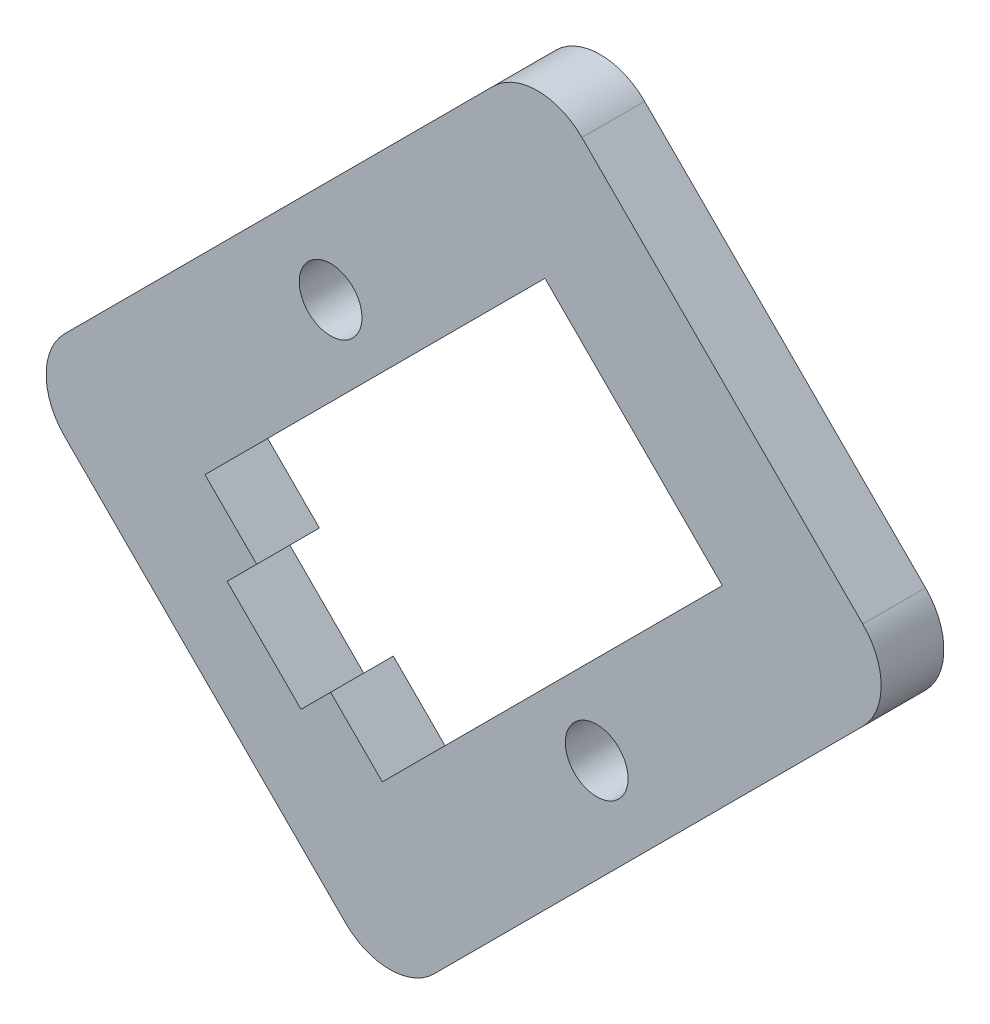
ISO-10303-21;
HEADER;
FILE_DESCRIPTION(('STEP AP214'),'2;1');
FILE_NAME('part.step','',(''),(''),'','','');
FILE_SCHEMA(('AUTOMOTIVE_DESIGN { 1 0 10303 214 1 1 1 1 }'));
ENDSEC;
DATA;
#1=APPLICATION_CONTEXT('core data for automotive mechanical design processes');
#2=APPLICATION_PROTOCOL_DEFINITION('international standard','automotive_design',2000,#1);
#3=PRODUCT_CONTEXT('',#1,'mechanical');
#4=PRODUCT('Part','Part','',(#3));
#5=PRODUCT_RELATED_PRODUCT_CATEGORY('part','',(#4));
#6=PRODUCT_DEFINITION_FORMATION('','',#4);
#7=PRODUCT_DEFINITION_CONTEXT('part definition',#1,'design');
#8=PRODUCT_DEFINITION('design','',#6,#7);
#9=PRODUCT_DEFINITION_SHAPE('','',#8);
#10=(LENGTH_UNIT() NAMED_UNIT(*) SI_UNIT(.MILLI.,.METRE.));
#11=(NAMED_UNIT(*) PLANE_ANGLE_UNIT() SI_UNIT($,.RADIAN.));
#12=(NAMED_UNIT(*) SI_UNIT($,.STERADIAN.) SOLID_ANGLE_UNIT());
#13=UNCERTAINTY_MEASURE_WITH_UNIT(LENGTH_MEASURE(1.E-05),#10,'distance_accuracy_value','');
#14=(GEOMETRIC_REPRESENTATION_CONTEXT(3) GLOBAL_UNCERTAINTY_ASSIGNED_CONTEXT((#13)) GLOBAL_UNIT_ASSIGNED_CONTEXT((#10,
#11,#12)) REPRESENTATION_CONTEXT('',''));
#15=CARTESIAN_POINT('',(0.,0.,0.));
#16=DIRECTION('',(0.,0.,1.));
#17=DIRECTION('',(1.,0.,0.));
#18=AXIS2_PLACEMENT_3D('',#15,#16,#17);
#19=CARTESIAN_POINT('',(77.9726304703363,27.0293999836904,3.));
#20=DIRECTION('',(0.,0.,1.));
#21=DIRECTION('',(1.,0.,0.));
#22=AXIS2_PLACEMENT_3D('',#19,#20,#21);
#23=PLANE('',#22);
#24=CARTESIAN_POINT('',(75.1442033479472,50.3639237628465,3.));
#25=DIRECTION('',(0.,0.,1.));
#26=DIRECTION('',(1.,0.,0.));
#27=AXIS2_PLACEMENT_3D('',#24,#25,#26);
#28=CIRCLE('',#27,1.50000000166663);
#29=CARTESIAN_POINT('',(76.6442033496138,50.3639237628465,3.));
#30=VERTEX_POINT('',#29);
#31=EDGE_CURVE('E184',#30,#30,#28,.T.);
#32=ORIENTED_EDGE('',*,*,#31,.F.);
#33=EDGE_LOOP('',(#32));
#34=FACE_BOUND('',#33,.T.);
#35=CARTESIAN_POINT('',(77.9726304703363,27.0293999836904,3.));
#36=DIRECTION('',(0.,0.,1.));
#37=DIRECTION('',(1.,0.,0.));
#38=AXIS2_PLACEMENT_3D('',#35,#36,#37);
#39=CIRCLE('',#38,3.00000000000005);
#40=CARTESIAN_POINT('',(75.8513101267766,24.9080796401308,3.));
#41=VERTEX_POINT('',#40);
#42=CARTESIAN_POINT('',(80.093950813896,24.9080796401308,3.));
#43=VERTEX_POINT('',#42);
#44=EDGE_CURVE('E214',#41,#43,#39,.T.);
#45=ORIENTED_EDGE('',*,*,#44,.T.);
#46=DIRECTION('',(0.70710678118655,0.707106781186545,0.));
#47=VECTOR('',#46,1.);
#48=CARTESIAN_POINT('',(80.093950813896,24.9080796401308,3.));
#49=LINE('',#48,#47);
#50=CARTESIAN_POINT('',(100.600047468306,45.4141762945406,3.));
#51=VERTEX_POINT('',#50);
#52=EDGE_CURVE('E217',#43,#51,#49,.T.);
#53=ORIENTED_EDGE('',*,*,#52,.T.);
#54=CARTESIAN_POINT('',(98.4787271247462,47.5354966381002,3.));
#55=DIRECTION('',(0.,0.,1.));
#56=DIRECTION('',(1.,0.,0.));
#57=AXIS2_PLACEMENT_3D('',#54,#55,#56);
#58=CIRCLE('',#57,3.00000000000005);
#59=CARTESIAN_POINT('',(100.600047468306,49.65681698166,3.));
#60=VERTEX_POINT('',#59);
#61=EDGE_CURVE('E220',#51,#60,#58,.T.);
#62=ORIENTED_EDGE('',*,*,#61,.T.);
#63=DIRECTION('',(-0.707106781186544,0.707106781186551,0.));
#64=VECTOR('',#63,1.);
#65=CARTESIAN_POINT('',(87.1650186257615,63.0918458242043,3.));
#66=LINE('',#65,#64);
#67=CARTESIAN_POINT('',(87.1650186257615,63.0918458242043,3.));
#68=VERTEX_POINT('',#67);
#69=EDGE_CURVE('E222',#60,#68,#66,.T.);
#70=ORIENTED_EDGE('',*,*,#69,.T.);
#71=CARTESIAN_POINT('',(85.0436982822019,60.9705254806447,3.));
#72=DIRECTION('',(0.,0.,1.));
#73=DIRECTION('',(1.,0.,0.));
#74=AXIS2_PLACEMENT_3D('',#71,#72,#73);
#75=CIRCLE('',#74,3.00000000000002);
#76=CARTESIAN_POINT('',(82.9223779386422,63.0918458242043,3.));
#77=VERTEX_POINT('',#76);
#78=EDGE_CURVE('E224',#68,#77,#75,.T.);
#79=ORIENTED_EDGE('',*,*,#78,.T.);
#80=DIRECTION('',(-0.707106781186546,-0.707106781186549,0.));
#81=VECTOR('',#80,1.);
#82=CARTESIAN_POINT('',(82.9223779386422,63.0918458242043,3.));
#83=LINE('',#82,#81);
#84=CARTESIAN_POINT('',(62.4162812842323,42.5857491697944,3.));
#85=VERTEX_POINT('',#84);
#86=EDGE_CURVE('E226',#77,#85,#83,.T.);
#87=ORIENTED_EDGE('',*,*,#86,.T.);
#88=CARTESIAN_POINT('',(64.537601627792,40.4644288262348,3.));
#89=DIRECTION('',(0.,0.,1.));
#90=DIRECTION('',(1.,0.,0.));
#91=AXIS2_PLACEMENT_3D('',#88,#89,#90);
#92=CIRCLE('',#91,2.99999999999997);
#93=CARTESIAN_POINT('',(62.4162812842324,38.3431084826752,3.));
#94=VERTEX_POINT('',#93);
#95=EDGE_CURVE('E228',#85,#94,#92,.T.);
#96=ORIENTED_EDGE('',*,*,#95,.T.);
#97=DIRECTION('',(0.707106781186543,-0.707106781186552,0.));
#98=VECTOR('',#97,1.);
#99=CARTESIAN_POINT('',(62.4162812842324,38.3431084826752,3.));
#100=LINE('',#99,#98);
#101=EDGE_CURVE('E230',#94,#41,#100,.T.);
#102=ORIENTED_EDGE('',*,*,#101,.T.);
#103=EDGE_LOOP('',(#45,#53,#62,#70,#79,#87,#96,#102));
#104=FACE_BOUND('',#103,.T.);
#105=DIRECTION('',(0.707106781186547,-0.707106781186549,0.));
#106=VECTOR('',#105,1.);
#107=CARTESIAN_POINT('',(75.1442033455902,34.1004677955558,3.));
#108=LINE('',#107,#106);
#109=CARTESIAN_POINT('',(75.1442033455902,34.1004677955558,3.));
#110=VERTEX_POINT('',#109);
#111=CARTESIAN_POINT('',(77.6190770797431,31.625594061403,3.));
#112=VERTEX_POINT('',#111);
#113=EDGE_CURVE('E154',#110,#112,#108,.T.);
#114=ORIENTED_EDGE('',*,*,#113,.F.);
#115=DIRECTION('',(0.707106781186553,0.707106781186542,0.));
#116=VECTOR('',#115,1.);
#117=CARTESIAN_POINT('',(73.729919072539,32.6861835225046,3.));
#118=LINE('',#117,#116);
#119=CARTESIAN_POINT('',(73.729919072539,32.6861835225046,3.));
#120=VERTEX_POINT('',#119);
#121=EDGE_CURVE('E146',#120,#110,#118,.T.);
#122=ORIENTED_EDGE('',*,*,#121,.F.);
#123=DIRECTION('',(0.707106781186557,-0.707106781186538,0.));
#124=VECTOR('',#123,1.);
#125=CARTESIAN_POINT('',(70.1943851666062,36.2217174284374,3.));
#126=LINE('',#125,#124);
#127=CARTESIAN_POINT('',(70.1943851666062,36.2217174284374,3.));
#128=VERTEX_POINT('',#127);
#129=EDGE_CURVE('E181',#128,#120,#126,.T.);
#130=ORIENTED_EDGE('',*,*,#129,.F.);
#131=DIRECTION('',(-0.70710678118657,-0.707106781186525,0.));
#132=VECTOR('',#131,1.);
#133=CARTESIAN_POINT('',(71.6086694396575,37.6360017014886,3.));
#134=LINE('',#133,#132);
#135=CARTESIAN_POINT('',(71.6086694396575,37.6360017014886,3.));
#136=VERTEX_POINT('',#135);
#137=EDGE_CURVE('E179',#136,#128,#134,.T.);
#138=ORIENTED_EDGE('',*,*,#137,.F.);
#139=DIRECTION('',(0.707106781186555,-0.70710678118654,0.));
#140=VECTOR('',#139,1.);
#141=CARTESIAN_POINT('',(69.1337957055045,40.1108754356415,3.));
#142=LINE('',#141,#140);
#143=CARTESIAN_POINT('',(69.1337957055045,40.1108754356415,3.));
#144=VERTEX_POINT('',#143);
#145=EDGE_CURVE('E177',#144,#136,#142,.T.);
#146=ORIENTED_EDGE('',*,*,#145,.F.);
#147=DIRECTION('',(-0.707106781186547,-0.707106781186548,0.));
#148=VECTOR('',#147,1.);
#149=CARTESIAN_POINT('',(85.3972516727952,56.3743314029322,3.));
#150=LINE('',#149,#148);
#151=CARTESIAN_POINT('',(85.3972516727952,56.3743314029322,3.));
#152=VERTEX_POINT('',#151);
#153=EDGE_CURVE('E175',#152,#144,#150,.T.);
#154=ORIENTED_EDGE('',*,*,#153,.F.);
#155=DIRECTION('',(-0.707106781186539,0.707106781186556,0.));
#156=VECTOR('',#155,1.);
#157=CARTESIAN_POINT('',(93.8825330470337,47.8890500286935,3.));
#158=LINE('',#157,#156);
#159=CARTESIAN_POINT('',(93.8825330470337,47.8890500286935,3.));
#160=VERTEX_POINT('',#159);
#161=EDGE_CURVE('E170',#160,#152,#158,.T.);
#162=ORIENTED_EDGE('',*,*,#161,.F.);
#163=DIRECTION('',(0.707106781186549,0.707106781186546,0.));
#164=VECTOR('',#163,1.);
#165=CARTESIAN_POINT('',(77.6190770797431,31.625594061403,3.));
#166=LINE('',#165,#164);
#167=EDGE_CURVE('E168',#112,#160,#166,.T.);
#168=ORIENTED_EDGE('',*,*,#167,.F.);
#169=EDGE_LOOP('',(#114,#122,#130,#138,#146,#154,#162,#168));
#170=FACE_BOUND('',#169,.T.);
#171=CARTESIAN_POINT('',(87.872125409305,37.6360017014886,3.));
#172=DIRECTION('',(0.,0.,1.));
#173=DIRECTION('',(1.,0.,0.));
#174=AXIS2_PLACEMENT_3D('',#171,#172,#173);
#175=CIRCLE('',#174,1.5000000016666);
#176=CARTESIAN_POINT('',(89.3721254109716,37.6360017014886,3.));
#177=VERTEX_POINT('',#176);
#178=EDGE_CURVE('E370',#177,#177,#175,.T.);
#179=ORIENTED_EDGE('',*,*,#178,.F.);
#180=EDGE_LOOP('',(#179));
#181=FACE_BOUND('',#180,.T.);
#182=ADVANCED_FACE('F33',(#34,#104,#170,#181),#23,.T.);
#183=CARTESIAN_POINT('',(77.9726304703363,27.0293999836904,0.));
#184=DIRECTION('',(0.,0.,1.));
#185=DIRECTION('',(1.,0.,0.));
#186=AXIS2_PLACEMENT_3D('',#183,#184,#185);
#187=PLANE('',#186);
#188=CARTESIAN_POINT('',(77.9726304703363,27.0293999836904,0.));
#189=DIRECTION('',(0.,0.,1.));
#190=DIRECTION('',(1.,0.,0.));
#191=AXIS2_PLACEMENT_3D('',#188,#189,#190);
#192=CIRCLE('',#191,3.00000000000005);
#193=CARTESIAN_POINT('',(75.8513101267766,24.9080796401308,0.));
#194=VERTEX_POINT('',#193);
#195=CARTESIAN_POINT('',(80.093950813896,24.9080796401308,0.));
#196=VERTEX_POINT('',#195);
#197=EDGE_CURVE('E162',#194,#196,#192,.T.);
#198=ORIENTED_EDGE('',*,*,#197,.F.);
#199=DIRECTION('',(0.707106781186543,-0.707106781186552,0.));
#200=VECTOR('',#199,1.);
#201=CARTESIAN_POINT('',(62.4162812842324,38.3431084826752,0.));
#202=LINE('',#201,#200);
#203=CARTESIAN_POINT('',(62.4162812842324,38.3431084826752,0.));
#204=VERTEX_POINT('',#203);
#205=EDGE_CURVE('E218',#204,#194,#202,.T.);
#206=ORIENTED_EDGE('',*,*,#205,.F.);
#207=CARTESIAN_POINT('',(64.537601627792,40.4644288262348,0.));
#208=DIRECTION('',(0.,0.,1.));
#209=DIRECTION('',(1.,0.,0.));
#210=AXIS2_PLACEMENT_3D('',#207,#208,#209);
#211=CIRCLE('',#210,2.99999999999997);
#212=CARTESIAN_POINT('',(62.4162812842323,42.5857491697944,0.));
#213=VERTEX_POINT('',#212);
#214=EDGE_CURVE('E245',#213,#204,#211,.T.);
#215=ORIENTED_EDGE('',*,*,#214,.F.);
#216=DIRECTION('',(-0.707106781186546,-0.707106781186549,0.));
#217=VECTOR('',#216,1.);
#218=CARTESIAN_POINT('',(82.9223779386422,63.0918458242043,0.));
#219=LINE('',#218,#217);
#220=CARTESIAN_POINT('',(82.9223779386422,63.0918458242043,0.));
#221=VERTEX_POINT('',#220);
#222=EDGE_CURVE('E243',#221,#213,#219,.T.);
#223=ORIENTED_EDGE('',*,*,#222,.F.);
#224=CARTESIAN_POINT('',(85.0436982822019,60.9705254806447,0.));
#225=DIRECTION('',(0.,0.,1.));
#226=DIRECTION('',(1.,0.,0.));
#227=AXIS2_PLACEMENT_3D('',#224,#225,#226);
#228=CIRCLE('',#227,3.00000000000002);
#229=CARTESIAN_POINT('',(87.1650186257615,63.0918458242043,0.));
#230=VERTEX_POINT('',#229);
#231=EDGE_CURVE('E241',#230,#221,#228,.T.);
#232=ORIENTED_EDGE('',*,*,#231,.F.);
#233=DIRECTION('',(-0.707106781186544,0.707106781186551,0.));
#234=VECTOR('',#233,1.);
#235=CARTESIAN_POINT('',(87.1650186257615,63.0918458242043,0.));
#236=LINE('',#235,#234);
#237=CARTESIAN_POINT('',(100.600047468306,49.65681698166,0.));
#238=VERTEX_POINT('',#237);
#239=EDGE_CURVE('E239',#238,#230,#236,.T.);
#240=ORIENTED_EDGE('',*,*,#239,.F.);
#241=CARTESIAN_POINT('',(98.4787271247462,47.5354966381002,0.));
#242=DIRECTION('',(0.,0.,1.));
#243=DIRECTION('',(1.,0.,0.));
#244=AXIS2_PLACEMENT_3D('',#241,#242,#243);
#245=CIRCLE('',#244,3.00000000000005);
#246=CARTESIAN_POINT('',(100.600047468306,45.4141762945406,0.));
#247=VERTEX_POINT('',#246);
#248=EDGE_CURVE('E237',#247,#238,#245,.T.);
#249=ORIENTED_EDGE('',*,*,#248,.F.);
#250=DIRECTION('',(0.70710678118655,0.707106781186545,0.));
#251=VECTOR('',#250,1.);
#252=CARTESIAN_POINT('',(80.093950813896,24.9080796401308,0.));
#253=LINE('',#252,#251);
#254=EDGE_CURVE('E235',#196,#247,#253,.T.);
#255=ORIENTED_EDGE('',*,*,#254,.F.);
#256=EDGE_LOOP('',(#198,#206,#215,#223,#232,#240,#249,#255));
#257=FACE_BOUND('',#256,.T.);
#258=DIRECTION('',(0.707106781186553,0.707106781186542,0.));
#259=VECTOR('',#258,1.);
#260=CARTESIAN_POINT('',(73.729919072539,32.6861835225046,0.));
#261=LINE('',#260,#259);
#262=CARTESIAN_POINT('',(73.729919072539,32.6861835225046,0.));
#263=VERTEX_POINT('',#262);
#264=CARTESIAN_POINT('',(75.1442033455902,34.1004677955558,0.));
#265=VERTEX_POINT('',#264);
#266=EDGE_CURVE('E56',#263,#265,#261,.T.);
#267=ORIENTED_EDGE('',*,*,#266,.T.);
#268=DIRECTION('',(0.707106781186547,-0.707106781186549,0.));
#269=VECTOR('',#268,1.);
#270=CARTESIAN_POINT('',(75.1442033455902,34.1004677955558,0.));
#271=LINE('',#270,#269);
#272=CARTESIAN_POINT('',(77.6190770797431,31.625594061403,0.));
#273=VERTEX_POINT('',#272);
#274=EDGE_CURVE('E161',#265,#273,#271,.T.);
#275=ORIENTED_EDGE('',*,*,#274,.T.);
#276=DIRECTION('',(0.707106781186549,0.707106781186546,0.));
#277=VECTOR('',#276,1.);
#278=CARTESIAN_POINT('',(77.6190770797431,31.625594061403,0.));
#279=LINE('',#278,#277);
#280=CARTESIAN_POINT('',(93.8825330470337,47.8890500286935,0.));
#281=VERTEX_POINT('',#280);
#282=EDGE_CURVE('E186',#273,#281,#279,.T.);
#283=ORIENTED_EDGE('',*,*,#282,.T.);
#284=DIRECTION('',(-0.707106781186539,0.707106781186556,0.));
#285=VECTOR('',#284,1.);
#286=CARTESIAN_POINT('',(93.8825330470337,47.8890500286935,0.));
#287=LINE('',#286,#285);
#288=CARTESIAN_POINT('',(85.3972516727952,56.3743314029322,0.));
#289=VERTEX_POINT('',#288);
#290=EDGE_CURVE('E189',#281,#289,#287,.T.);
#291=ORIENTED_EDGE('',*,*,#290,.T.);
#292=DIRECTION('',(-0.707106781186547,-0.707106781186548,0.));
#293=VECTOR('',#292,1.);
#294=CARTESIAN_POINT('',(85.3972516727952,56.3743314029322,0.));
#295=LINE('',#294,#293);
#296=CARTESIAN_POINT('',(69.1337957055045,40.1108754356415,0.));
#297=VERTEX_POINT('',#296);
#298=EDGE_CURVE('E192',#289,#297,#295,.T.);
#299=ORIENTED_EDGE('',*,*,#298,.T.);
#300=DIRECTION('',(0.707106781186555,-0.70710678118654,0.));
#301=VECTOR('',#300,1.);
#302=CARTESIAN_POINT('',(69.1337957055045,40.1108754356415,0.));
#303=LINE('',#302,#301);
#304=CARTESIAN_POINT('',(71.6086694396575,37.6360017014886,0.));
#305=VERTEX_POINT('',#304);
#306=EDGE_CURVE('E195',#297,#305,#303,.T.);
#307=ORIENTED_EDGE('',*,*,#306,.T.);
#308=DIRECTION('',(-0.70710678118657,-0.707106781186525,0.));
#309=VECTOR('',#308,1.);
#310=CARTESIAN_POINT('',(71.6086694396575,37.6360017014886,0.));
#311=LINE('',#310,#309);
#312=CARTESIAN_POINT('',(70.1943851666062,36.2217174284374,0.));
#313=VERTEX_POINT('',#312);
#314=EDGE_CURVE('E198',#305,#313,#311,.T.);
#315=ORIENTED_EDGE('',*,*,#314,.T.);
#316=DIRECTION('',(0.707106781186557,-0.707106781186538,0.));
#317=VECTOR('',#316,1.);
#318=CARTESIAN_POINT('',(70.1943851666062,36.2217174284374,0.));
#319=LINE('',#318,#317);
#320=EDGE_CURVE('E155',#313,#263,#319,.T.);
#321=ORIENTED_EDGE('',*,*,#320,.T.);
#322=EDGE_LOOP('',(#267,#275,#283,#291,#299,#307,#315,#321));
#323=FACE_BOUND('',#322,.T.);
#324=CARTESIAN_POINT('',(75.1442033479472,50.3639237628465,0.));
#325=DIRECTION('',(0.,0.,1.));
#326=DIRECTION('',(1.,0.,0.));
#327=AXIS2_PLACEMENT_3D('',#324,#325,#326);
#328=CIRCLE('',#327,1.50000000166663);
#329=CARTESIAN_POINT('',(76.6442033496138,50.3639237628465,0.));
#330=VERTEX_POINT('',#329);
#331=EDGE_CURVE('E376',#330,#330,#328,.T.);
#332=ORIENTED_EDGE('',*,*,#331,.T.);
#333=EDGE_LOOP('',(#332));
#334=FACE_BOUND('',#333,.T.);
#335=CARTESIAN_POINT('',(87.872125409305,37.6360017014886,0.));
#336=DIRECTION('',(0.,0.,1.));
#337=DIRECTION('',(1.,0.,0.));
#338=AXIS2_PLACEMENT_3D('',#335,#336,#337);
#339=CIRCLE('',#338,1.5000000016666);
#340=CARTESIAN_POINT('',(89.3721254109716,37.6360017014886,0.));
#341=VERTEX_POINT('',#340);
#342=EDGE_CURVE('E373',#341,#341,#339,.T.);
#343=ORIENTED_EDGE('',*,*,#342,.T.);
#344=EDGE_LOOP('',(#343));
#345=FACE_BOUND('',#344,.T.);
#346=ADVANCED_FACE('F275',(#257,#323,#334,#345),#187,.F.);
#347=CARTESIAN_POINT('',(77.9726304703363,27.0293999836904,3.));
#348=DIRECTION('',(0.,0.,-1.));
#349=DIRECTION('',(-1.,0.,0.));
#350=AXIS2_PLACEMENT_3D('',#347,#348,#349);
#351=CYLINDRICAL_SURFACE('',#350,3.00000000000005);
#352=ORIENTED_EDGE('',*,*,#197,.T.);
#353=DIRECTION('',(0.,0.,-1.));
#354=VECTOR('',#353,1.);
#355=CARTESIAN_POINT('',(80.093950813896,24.9080796401308,3.));
#356=LINE('',#355,#354);
#357=EDGE_CURVE('E11',#43,#196,#356,.T.);
#358=ORIENTED_EDGE('',*,*,#357,.F.);
#359=ORIENTED_EDGE('',*,*,#44,.F.);
#360=DIRECTION('',(0.,0.,-1.));
#361=VECTOR('',#360,1.);
#362=CARTESIAN_POINT('',(75.8513101267766,24.9080796401308,3.));
#363=LINE('',#362,#361);
#364=EDGE_CURVE('E232',#41,#194,#363,.T.);
#365=ORIENTED_EDGE('',*,*,#364,.T.);
#366=EDGE_LOOP('',(#352,#358,#359,#365));
#367=FACE_BOUND('',#366,.T.);
#368=ADVANCED_FACE('F35',(#367),#351,.T.);
#369=CARTESIAN_POINT('',(80.093950813896,24.9080796401308,3.));
#370=DIRECTION('',(-0.707106781186545,0.70710678118655,0.));
#371=DIRECTION('',(-0.70710678118655,-0.707106781186545,0.));
#372=AXIS2_PLACEMENT_3D('',#369,#370,#371);
#373=PLANE('',#372);
#374=ORIENTED_EDGE('',*,*,#254,.T.);
#375=DIRECTION('',(0.,0.,-1.));
#376=VECTOR('',#375,1.);
#377=CARTESIAN_POINT('',(100.600047468306,45.4141762945406,3.));
#378=LINE('',#377,#376);
#379=EDGE_CURVE('E41',#51,#247,#378,.T.);
#380=ORIENTED_EDGE('',*,*,#379,.F.);
#381=ORIENTED_EDGE('',*,*,#52,.F.);
#382=ORIENTED_EDGE('',*,*,#357,.T.);
#383=EDGE_LOOP('',(#374,#380,#381,#382));
#384=FACE_BOUND('',#383,.T.);
#385=ADVANCED_FACE('F292',(#384),#373,.F.);
#386=CARTESIAN_POINT('',(98.4787271247462,47.5354966381002,3.));
#387=DIRECTION('',(0.,0.,-1.));
#388=DIRECTION('',(-1.,0.,0.));
#389=AXIS2_PLACEMENT_3D('',#386,#387,#388);
#390=CYLINDRICAL_SURFACE('',#389,3.00000000000005);
#391=ORIENTED_EDGE('',*,*,#248,.T.);
#392=DIRECTION('',(0.,0.,-1.));
#393=VECTOR('',#392,1.);
#394=CARTESIAN_POINT('',(100.600047468306,49.65681698166,3.));
#395=LINE('',#394,#393);
#396=EDGE_CURVE('E262',#60,#238,#395,.T.);
#397=ORIENTED_EDGE('',*,*,#396,.F.);
#398=ORIENTED_EDGE('',*,*,#61,.F.);
#399=ORIENTED_EDGE('',*,*,#379,.T.);
#400=EDGE_LOOP('',(#391,#397,#398,#399));
#401=FACE_BOUND('',#400,.T.);
#402=ADVANCED_FACE('F269',(#401),#390,.T.);
#403=CARTESIAN_POINT('',(87.1650186257615,63.0918458242043,3.));
#404=DIRECTION('',(-0.707106781186551,-0.707106781186544,0.));
#405=DIRECTION('',(0.707106781186544,-0.707106781186551,0.));
#406=AXIS2_PLACEMENT_3D('',#403,#404,#405);
#407=PLANE('',#406);
#408=ORIENTED_EDGE('',*,*,#239,.T.);
#409=DIRECTION('',(0.,0.,-1.));
#410=VECTOR('',#409,1.);
#411=CARTESIAN_POINT('',(87.1650186257615,63.0918458242043,3.));
#412=LINE('',#411,#410);
#413=EDGE_CURVE('E259',#68,#230,#412,.T.);
#414=ORIENTED_EDGE('',*,*,#413,.F.);
#415=ORIENTED_EDGE('',*,*,#69,.F.);
#416=ORIENTED_EDGE('',*,*,#396,.T.);
#417=EDGE_LOOP('',(#408,#414,#415,#416));
#418=FACE_BOUND('',#417,.T.);
#419=ADVANCED_FACE('F281',(#418),#407,.F.);
#420=CARTESIAN_POINT('',(85.0436982822019,60.9705254806447,3.));
#421=DIRECTION('',(0.,0.,-1.));
#422=DIRECTION('',(-1.,0.,0.));
#423=AXIS2_PLACEMENT_3D('',#420,#421,#422);
#424=CYLINDRICAL_SURFACE('',#423,3.00000000000002);
#425=ORIENTED_EDGE('',*,*,#231,.T.);
#426=DIRECTION('',(0.,0.,-1.));
#427=VECTOR('',#426,1.);
#428=CARTESIAN_POINT('',(82.9223779386422,63.0918458242043,3.));
#429=LINE('',#428,#427);
#430=EDGE_CURVE('E256',#77,#221,#429,.T.);
#431=ORIENTED_EDGE('',*,*,#430,.F.);
#432=ORIENTED_EDGE('',*,*,#78,.F.);
#433=ORIENTED_EDGE('',*,*,#413,.T.);
#434=EDGE_LOOP('',(#425,#431,#432,#433));
#435=FACE_BOUND('',#434,.T.);
#436=ADVANCED_FACE('F285',(#435),#424,.T.);
#437=CARTESIAN_POINT('',(82.9223779386422,63.0918458242043,3.));
#438=DIRECTION('',(0.707106781186549,-0.707106781186546,0.));
#439=DIRECTION('',(0.707106781186546,0.707106781186549,0.));
#440=AXIS2_PLACEMENT_3D('',#437,#438,#439);
#441=PLANE('',#440);
#442=ORIENTED_EDGE('',*,*,#222,.T.);
#443=DIRECTION('',(0.,0.,-1.));
#444=VECTOR('',#443,1.);
#445=CARTESIAN_POINT('',(62.4162812842323,42.5857491697944,3.));
#446=LINE('',#445,#444);
#447=EDGE_CURVE('E253',#85,#213,#446,.T.);
#448=ORIENTED_EDGE('',*,*,#447,.F.);
#449=ORIENTED_EDGE('',*,*,#86,.F.);
#450=ORIENTED_EDGE('',*,*,#430,.T.);
#451=EDGE_LOOP('',(#442,#448,#449,#450));
#452=FACE_BOUND('',#451,.T.);
#453=ADVANCED_FACE('F305',(#452),#441,.F.);
#454=CARTESIAN_POINT('',(64.537601627792,40.4644288262348,3.));
#455=DIRECTION('',(0.,0.,-1.));
#456=DIRECTION('',(-1.,0.,0.));
#457=AXIS2_PLACEMENT_3D('',#454,#455,#456);
#458=CYLINDRICAL_SURFACE('',#457,2.99999999999997);
#459=ORIENTED_EDGE('',*,*,#214,.T.);
#460=DIRECTION('',(0.,0.,-1.));
#461=VECTOR('',#460,1.);
#462=CARTESIAN_POINT('',(62.4162812842324,38.3431084826752,3.));
#463=LINE('',#462,#461);
#464=EDGE_CURVE('E250',#94,#204,#463,.T.);
#465=ORIENTED_EDGE('',*,*,#464,.F.);
#466=ORIENTED_EDGE('',*,*,#95,.F.);
#467=ORIENTED_EDGE('',*,*,#447,.T.);
#468=EDGE_LOOP('',(#459,#465,#466,#467));
#469=FACE_BOUND('',#468,.T.);
#470=ADVANCED_FACE('F303',(#469),#458,.T.);
#471=CARTESIAN_POINT('',(62.4162812842324,38.3431084826752,3.));
#472=DIRECTION('',(0.707106781186552,0.707106781186543,0.));
#473=DIRECTION('',(-0.707106781186543,0.707106781186552,0.));
#474=AXIS2_PLACEMENT_3D('',#471,#472,#473);
#475=PLANE('',#474);
#476=ORIENTED_EDGE('',*,*,#205,.T.);
#477=ORIENTED_EDGE('',*,*,#364,.F.);
#478=ORIENTED_EDGE('',*,*,#101,.F.);
#479=ORIENTED_EDGE('',*,*,#464,.T.);
#480=EDGE_LOOP('',(#476,#477,#478,#479));
#481=FACE_BOUND('',#480,.T.);
#482=ADVANCED_FACE('F298',(#481),#475,.F.);
#483=CARTESIAN_POINT('',(73.729919072539,32.6861835225046,3.));
#484=DIRECTION('',(-0.707106781186542,0.707106781186553,0.));
#485=DIRECTION('',(-0.707106781186553,-0.707106781186542,0.));
#486=AXIS2_PLACEMENT_3D('',#483,#484,#485);
#487=PLANE('',#486);
#488=ORIENTED_EDGE('',*,*,#266,.F.);
#489=DIRECTION('',(0.,0.,-1.));
#490=VECTOR('',#489,1.);
#491=CARTESIAN_POINT('',(73.729919072539,32.6861835225046,3.));
#492=LINE('',#491,#490);
#493=EDGE_CURVE('E150',#120,#263,#492,.T.);
#494=ORIENTED_EDGE('',*,*,#493,.F.);
#495=ORIENTED_EDGE('',*,*,#121,.T.);
#496=DIRECTION('',(0.,0.,-1.));
#497=VECTOR('',#496,1.);
#498=CARTESIAN_POINT('',(75.1442033455902,34.1004677955558,3.));
#499=LINE('',#498,#497);
#500=EDGE_CURVE('E149',#110,#265,#499,.T.);
#501=ORIENTED_EDGE('',*,*,#500,.T.);
#502=EDGE_LOOP('',(#488,#494,#495,#501));
#503=FACE_BOUND('',#502,.T.);
#504=ADVANCED_FACE('F148',(#503),#487,.T.);
#505=CARTESIAN_POINT('',(75.1442033455902,34.1004677955558,3.));
#506=DIRECTION('',(0.707106781186548,0.707106781186546,0.));
#507=DIRECTION('',(-0.707106781186547,0.707106781186549,0.));
#508=AXIS2_PLACEMENT_3D('',#505,#506,#507);
#509=PLANE('',#508);
#510=ORIENTED_EDGE('',*,*,#274,.F.);
#511=ORIENTED_EDGE('',*,*,#500,.F.);
#512=ORIENTED_EDGE('',*,*,#113,.T.);
#513=DIRECTION('',(0.,0.,-1.));
#514=VECTOR('',#513,1.);
#515=CARTESIAN_POINT('',(77.6190770797431,31.625594061403,3.));
#516=LINE('',#515,#514);
#517=EDGE_CURVE('E163',#112,#273,#516,.T.);
#518=ORIENTED_EDGE('',*,*,#517,.T.);
#519=EDGE_LOOP('',(#510,#511,#512,#518));
#520=FACE_BOUND('',#519,.T.);
#521=ADVANCED_FACE('F158',(#520),#509,.T.);
#522=CARTESIAN_POINT('',(77.6190770797431,31.625594061403,3.));
#523=DIRECTION('',(-0.707106781186546,0.707106781186549,0.));
#524=DIRECTION('',(-0.707106781186549,-0.707106781186546,0.));
#525=AXIS2_PLACEMENT_3D('',#522,#523,#524);
#526=PLANE('',#525);
#527=ORIENTED_EDGE('',*,*,#282,.F.);
#528=ORIENTED_EDGE('',*,*,#517,.F.);
#529=ORIENTED_EDGE('',*,*,#167,.T.);
#530=DIRECTION('',(0.,0.,-1.));
#531=VECTOR('',#530,1.);
#532=CARTESIAN_POINT('',(93.8825330470337,47.8890500286935,3.));
#533=LINE('',#532,#531);
#534=EDGE_CURVE('E211',#160,#281,#533,.T.);
#535=ORIENTED_EDGE('',*,*,#534,.T.);
#536=EDGE_LOOP('',(#527,#528,#529,#535));
#537=FACE_BOUND('',#536,.T.);
#538=ADVANCED_FACE('F332',(#537),#526,.T.);
#539=CARTESIAN_POINT('',(93.8825330470337,47.8890500286935,3.));
#540=DIRECTION('',(-0.707106781186556,-0.707106781186539,0.));
#541=DIRECTION('',(0.707106781186539,-0.707106781186556,0.));
#542=AXIS2_PLACEMENT_3D('',#539,#540,#541);
#543=PLANE('',#542);
#544=ORIENTED_EDGE('',*,*,#290,.F.);
#545=ORIENTED_EDGE('',*,*,#534,.F.);
#546=ORIENTED_EDGE('',*,*,#161,.T.);
#547=DIRECTION('',(0.,0.,-1.));
#548=VECTOR('',#547,1.);
#549=CARTESIAN_POINT('',(85.3972516727952,56.3743314029322,3.));
#550=LINE('',#549,#548);
#551=EDGE_CURVE('E209',#152,#289,#550,.T.);
#552=ORIENTED_EDGE('',*,*,#551,.T.);
#553=EDGE_LOOP('',(#544,#545,#546,#552));
#554=FACE_BOUND('',#553,.T.);
#555=ADVANCED_FACE('F336',(#554),#543,.T.);
#556=CARTESIAN_POINT('',(85.3972516727952,56.3743314029322,3.));
#557=DIRECTION('',(0.707106781186548,-0.707106781186547,0.));
#558=DIRECTION('',(0.707106781186547,0.707106781186548,0.));
#559=AXIS2_PLACEMENT_3D('',#556,#557,#558);
#560=PLANE('',#559);
#561=ORIENTED_EDGE('',*,*,#298,.F.);
#562=ORIENTED_EDGE('',*,*,#551,.F.);
#563=ORIENTED_EDGE('',*,*,#153,.T.);
#564=DIRECTION('',(0.,0.,-1.));
#565=VECTOR('',#564,1.);
#566=CARTESIAN_POINT('',(69.1337957055045,40.1108754356415,3.));
#567=LINE('',#566,#565);
#568=EDGE_CURVE('E207',#144,#297,#567,.T.);
#569=ORIENTED_EDGE('',*,*,#568,.T.);
#570=EDGE_LOOP('',(#561,#562,#563,#569));
#571=FACE_BOUND('',#570,.T.);
#572=ADVANCED_FACE('F342',(#571),#560,.T.);
#573=CARTESIAN_POINT('',(69.1337957055045,40.1108754356415,3.));
#574=DIRECTION('',(0.70710678118654,0.707106781186555,0.));
#575=DIRECTION('',(-0.707106781186555,0.70710678118654,0.));
#576=AXIS2_PLACEMENT_3D('',#573,#574,#575);
#577=PLANE('',#576);
#578=ORIENTED_EDGE('',*,*,#306,.F.);
#579=ORIENTED_EDGE('',*,*,#568,.F.);
#580=ORIENTED_EDGE('',*,*,#145,.T.);
#581=DIRECTION('',(0.,0.,-1.));
#582=VECTOR('',#581,1.);
#583=CARTESIAN_POINT('',(71.6086694396575,37.6360017014886,3.));
#584=LINE('',#583,#582);
#585=EDGE_CURVE('E205',#136,#305,#584,.T.);
#586=ORIENTED_EDGE('',*,*,#585,.T.);
#587=EDGE_LOOP('',(#578,#579,#580,#586));
#588=FACE_BOUND('',#587,.T.);
#589=ADVANCED_FACE('F346',(#588),#577,.T.);
#590=CARTESIAN_POINT('',(71.6086694396575,37.6360017014886,3.));
#591=DIRECTION('',(0.707106781186525,-0.70710678118657,0.));
#592=DIRECTION('',(0.70710678118657,0.707106781186525,0.));
#593=AXIS2_PLACEMENT_3D('',#590,#591,#592);
#594=PLANE('',#593);
#595=ORIENTED_EDGE('',*,*,#314,.F.);
#596=ORIENTED_EDGE('',*,*,#585,.F.);
#597=ORIENTED_EDGE('',*,*,#137,.T.);
#598=DIRECTION('',(0.,0.,-1.));
#599=VECTOR('',#598,1.);
#600=CARTESIAN_POINT('',(70.1943851666062,36.2217174284374,3.));
#601=LINE('',#600,#599);
#602=EDGE_CURVE('E48',#128,#313,#601,.T.);
#603=ORIENTED_EDGE('',*,*,#602,.T.);
#604=EDGE_LOOP('',(#595,#596,#597,#603));
#605=FACE_BOUND('',#604,.T.);
#606=ADVANCED_FACE('F350',(#605),#594,.T.);
#607=CARTESIAN_POINT('',(70.1943851666062,36.2217174284374,3.));
#608=DIRECTION('',(0.707106781186538,0.707106781186557,0.));
#609=DIRECTION('',(-0.707106781186557,0.707106781186538,0.));
#610=AXIS2_PLACEMENT_3D('',#607,#608,#609);
#611=PLANE('',#610);
#612=ORIENTED_EDGE('',*,*,#320,.F.);
#613=ORIENTED_EDGE('',*,*,#602,.F.);
#614=ORIENTED_EDGE('',*,*,#129,.T.);
#615=ORIENTED_EDGE('',*,*,#493,.T.);
#616=EDGE_LOOP('',(#612,#613,#614,#615));
#617=FACE_BOUND('',#616,.T.);
#618=ADVANCED_FACE('F354',(#617),#611,.T.);
#619=CARTESIAN_POINT('',(75.1442033479472,50.3639237628465,3.));
#620=DIRECTION('',(0.,0.,-1.));
#621=DIRECTION('',(-1.,0.,0.));
#622=AXIS2_PLACEMENT_3D('',#619,#620,#621);
#623=CYLINDRICAL_SURFACE('',#622,1.50000000166663);
#624=ORIENTED_EDGE('',*,*,#31,.T.);
#625=EDGE_LOOP('',(#624));
#626=FACE_BOUND('',#625,.T.);
#627=ORIENTED_EDGE('',*,*,#331,.F.);
#628=EDGE_LOOP('',(#627));
#629=FACE_BOUND('',#628,.T.);
#630=ADVANCED_FACE('F358',(#626,#629),#623,.F.);
#631=CARTESIAN_POINT('',(87.872125409305,37.6360017014886,3.));
#632=DIRECTION('',(0.,0.,-1.));
#633=DIRECTION('',(-1.,0.,0.));
#634=AXIS2_PLACEMENT_3D('',#631,#632,#633);
#635=CYLINDRICAL_SURFACE('',#634,1.5000000016666);
#636=ORIENTED_EDGE('',*,*,#178,.T.);
#637=EDGE_LOOP('',(#636));
#638=FACE_BOUND('',#637,.T.);
#639=ORIENTED_EDGE('',*,*,#342,.F.);
#640=EDGE_LOOP('',(#639));
#641=FACE_BOUND('',#640,.T.);
#642=ADVANCED_FACE('F361',(#638,#641),#635,.F.);
#643=CLOSED_SHELL('',(#182,#346,#368,#385,#402,#419,#436,#453,#470,#482,#504,#521,#538,#555,
#572,#589,#606,#618,#630,#642));
#644=MANIFOLD_SOLID_BREP('B2',#643);
#645=ADVANCED_BREP_SHAPE_REPRESENTATION('',(#18,#644),#14);
#646=SHAPE_DEFINITION_REPRESENTATION(#9,#645);
ENDSEC;
END-ISO-10303-21;
